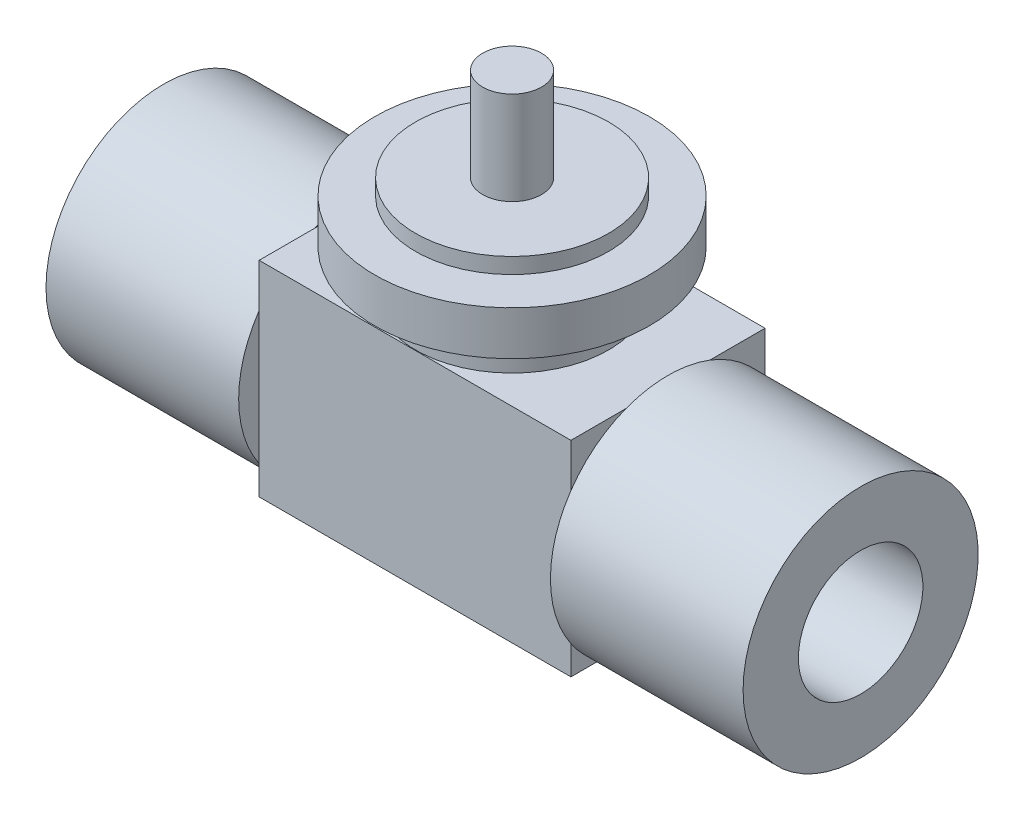
ISO-10303-21;
HEADER;
FILE_DESCRIPTION(('STEP AP214'),'2;1');
FILE_NAME('part.step','',(''),(''),'','','');
FILE_SCHEMA(('AUTOMOTIVE_DESIGN { 1 0 10303 214 1 1 1 1 }'));
ENDSEC;
DATA;
#1=APPLICATION_CONTEXT('core data for automotive mechanical design processes');
#2=APPLICATION_PROTOCOL_DEFINITION('international standard','automotive_design',2000,#1);
#3=PRODUCT_CONTEXT('',#1,'mechanical');
#4=PRODUCT('Part','Part','',(#3));
#5=PRODUCT_RELATED_PRODUCT_CATEGORY('part','',(#4));
#6=PRODUCT_DEFINITION_FORMATION('','',#4);
#7=PRODUCT_DEFINITION_CONTEXT('part definition',#1,'design');
#8=PRODUCT_DEFINITION('design','',#6,#7);
#9=PRODUCT_DEFINITION_SHAPE('','',#8);
#10=(LENGTH_UNIT() NAMED_UNIT(*) SI_UNIT(.MILLI.,.METRE.));
#11=(NAMED_UNIT(*) PLANE_ANGLE_UNIT() SI_UNIT($,.RADIAN.));
#12=(NAMED_UNIT(*) SI_UNIT($,.STERADIAN.) SOLID_ANGLE_UNIT());
#13=UNCERTAINTY_MEASURE_WITH_UNIT(LENGTH_MEASURE(1.E-05),#10,'distance_accuracy_value','');
#14=(GEOMETRIC_REPRESENTATION_CONTEXT(3) GLOBAL_UNCERTAINTY_ASSIGNED_CONTEXT((#13)) GLOBAL_UNIT_ASSIGNED_CONTEXT((#10,
#11,#12)) REPRESENTATION_CONTEXT('',''));
#15=CARTESIAN_POINT('',(0.,0.,0.));
#16=DIRECTION('',(0.,0.,1.));
#17=DIRECTION('',(1.,0.,0.));
#18=AXIS2_PLACEMENT_3D('',#15,#16,#17);
#19=CARTESIAN_POINT('',(-15.9,11.2,9.9));
#20=DIRECTION('',(1.,0.,0.));
#21=DIRECTION('',(0.,0.,-1.));
#22=AXIS2_PLACEMENT_3D('',#19,#20,#21);
#23=PLANE('',#22);
#24=CARTESIAN_POINT('',(-15.9,0.,0.));
#25=DIRECTION('',(-1.,0.,0.));
#26=DIRECTION('',(0.,0.,1.));
#27=AXIS2_PLACEMENT_3D('',#24,#25,#26);
#28=CIRCLE('',#27,11.988);
#29=CARTESIAN_POINT('',(-15.9,6.76033608631997,9.9));
#30=VERTEX_POINT('',#29);
#31=CARTESIAN_POINT('',(-15.9,11.2,4.27459284610828));
#32=VERTEX_POINT('',#31);
#33=EDGE_CURVE('E160',#30,#32,#28,.T.);
#34=ORIENTED_EDGE('',*,*,#33,.F.);
#35=DIRECTION('',(0.,-1.,0.));
#36=VECTOR('',#35,1.);
#37=CARTESIAN_POINT('',(-15.9,11.2,9.9));
#38=LINE('',#37,#36);
#39=CARTESIAN_POINT('',(-15.9,11.2,9.9));
#40=VERTEX_POINT('',#39);
#41=EDGE_CURVE('E136',#40,#30,#38,.T.);
#42=ORIENTED_EDGE('',*,*,#41,.F.);
#43=DIRECTION('',(0.,0.,-1.));
#44=VECTOR('',#43,1.);
#45=CARTESIAN_POINT('',(-15.9,11.2,9.9));
#46=LINE('',#45,#44);
#47=EDGE_CURVE('E205',#40,#32,#46,.T.);
#48=ORIENTED_EDGE('',*,*,#47,.T.);
#49=EDGE_LOOP('',(#34,#42,#48));
#50=FACE_BOUND('',#49,.T.);
#51=ADVANCED_FACE('F41',(#50),#23,.F.);
#52=CARTESIAN_POINT('',(-15.9,11.2,-4.27459284610828));
#53=VERTEX_POINT('',#52);
#54=CARTESIAN_POINT('',(-15.9,6.76033608631997,-9.9));
#55=VERTEX_POINT('',#54);
#56=EDGE_CURVE('E11',#53,#55,#28,.T.);
#57=ORIENTED_EDGE('',*,*,#56,.F.);
#58=CARTESIAN_POINT('',(-15.9,11.2,-9.9));
#59=VERTEX_POINT('',#58);
#60=EDGE_CURVE('E203',#53,#59,#46,.T.);
#61=ORIENTED_EDGE('',*,*,#60,.T.);
#62=DIRECTION('',(0.,-1.,0.));
#63=VECTOR('',#62,1.);
#64=CARTESIAN_POINT('',(-15.9,11.2,-9.9));
#65=LINE('',#64,#63);
#66=EDGE_CURVE('E182',#59,#55,#65,.T.);
#67=ORIENTED_EDGE('',*,*,#66,.T.);
#68=EDGE_LOOP('',(#57,#61,#67));
#69=FACE_BOUND('',#68,.T.);
#70=ADVANCED_FACE('F268',(#69),#23,.F.);
#71=CARTESIAN_POINT('',(-15.9,-6.76033608631997,-9.9));
#72=VERTEX_POINT('',#71);
#73=CARTESIAN_POINT('',(-15.9,-9.7,-7.04429868759127));
#74=VERTEX_POINT('',#73);
#75=EDGE_CURVE('E49',#72,#74,#28,.T.);
#76=ORIENTED_EDGE('',*,*,#75,.F.);
#77=CARTESIAN_POINT('',(-15.9,-9.7,-9.9));
#78=VERTEX_POINT('',#77);
#79=EDGE_CURVE('E183',#72,#78,#65,.T.);
#80=ORIENTED_EDGE('',*,*,#79,.T.);
#81=DIRECTION('',(0.,0.,-1.));
#82=VECTOR('',#81,1.);
#83=CARTESIAN_POINT('',(-15.9,-9.7,9.9));
#84=LINE('',#83,#82);
#85=EDGE_CURVE('E211',#74,#78,#84,.T.);
#86=ORIENTED_EDGE('',*,*,#85,.F.);
#87=EDGE_LOOP('',(#76,#80,#86));
#88=FACE_BOUND('',#87,.T.);
#89=ADVANCED_FACE('F277',(#88),#23,.F.);
#90=CARTESIAN_POINT('',(15.9,-9.7,9.9));
#91=DIRECTION('',(-1.,0.,0.));
#92=DIRECTION('',(0.,0.,1.));
#93=AXIS2_PLACEMENT_3D('',#90,#91,#92);
#94=PLANE('',#93);
#95=DIRECTION('',(0.,1.,0.));
#96=VECTOR('',#95,1.);
#97=CARTESIAN_POINT('',(15.9,-9.7,9.9));
#98=LINE('',#97,#96);
#99=CARTESIAN_POINT('',(15.9,6.76033608631997,9.9));
#100=VERTEX_POINT('',#99);
#101=CARTESIAN_POINT('',(15.9,11.2,9.9));
#102=VERTEX_POINT('',#101);
#103=EDGE_CURVE('E361',#100,#102,#98,.T.);
#104=ORIENTED_EDGE('',*,*,#103,.F.);
#105=CARTESIAN_POINT('',(15.9,0.,0.));
#106=DIRECTION('',(-1.,0.,0.));
#107=DIRECTION('',(0.,0.,1.));
#108=AXIS2_PLACEMENT_3D('',#105,#106,#107);
#109=CIRCLE('',#108,11.988);
#110=CARTESIAN_POINT('',(15.9,11.2,4.27459284610828));
#111=VERTEX_POINT('',#110);
#112=EDGE_CURVE('E171',#100,#111,#109,.T.);
#113=ORIENTED_EDGE('',*,*,#112,.T.);
#114=DIRECTION('',(0.,0.,-1.));
#115=VECTOR('',#114,1.);
#116=CARTESIAN_POINT('',(15.9,11.2,9.9));
#117=LINE('',#116,#115);
#118=EDGE_CURVE('E207',#102,#111,#117,.T.);
#119=ORIENTED_EDGE('',*,*,#118,.F.);
#120=EDGE_LOOP('',(#104,#113,#119));
#121=FACE_BOUND('',#120,.T.);
#122=ADVANCED_FACE('F288',(#121),#94,.F.);
#123=CARTESIAN_POINT('',(15.9,11.2,-4.27459284610828));
#124=VERTEX_POINT('',#123);
#125=CARTESIAN_POINT('',(15.9,11.2,-9.9));
#126=VERTEX_POINT('',#125);
#127=EDGE_CURVE('E201',#124,#126,#117,.T.);
#128=ORIENTED_EDGE('',*,*,#127,.F.);
#129=CARTESIAN_POINT('',(15.9,6.76033608631997,-9.9));
#130=VERTEX_POINT('',#129);
#131=EDGE_CURVE('E162',#124,#130,#109,.T.);
#132=ORIENTED_EDGE('',*,*,#131,.T.);
#133=DIRECTION('',(0.,1.,0.));
#134=VECTOR('',#133,1.);
#135=CARTESIAN_POINT('',(15.9,-9.7,-9.9));
#136=LINE('',#135,#134);
#137=EDGE_CURVE('E193',#130,#126,#136,.T.);
#138=ORIENTED_EDGE('',*,*,#137,.T.);
#139=EDGE_LOOP('',(#128,#132,#138));
#140=FACE_BOUND('',#139,.T.);
#141=ADVANCED_FACE('F290',(#140),#94,.F.);
#142=CARTESIAN_POINT('',(15.9,-9.7,-9.9));
#143=VERTEX_POINT('',#142);
#144=CARTESIAN_POINT('',(15.9,-6.76033608631997,-9.9));
#145=VERTEX_POINT('',#144);
#146=EDGE_CURVE('E196',#143,#145,#136,.T.);
#147=ORIENTED_EDGE('',*,*,#146,.T.);
#148=CARTESIAN_POINT('',(15.9,-9.7,-7.04429868759127));
#149=VERTEX_POINT('',#148);
#150=EDGE_CURVE('E165',#145,#149,#109,.T.);
#151=ORIENTED_EDGE('',*,*,#150,.T.);
#152=DIRECTION('',(0.,0.,-1.));
#153=VECTOR('',#152,1.);
#154=CARTESIAN_POINT('',(15.9,-9.7,9.9));
#155=LINE('',#154,#153);
#156=EDGE_CURVE('E209',#149,#143,#155,.T.);
#157=ORIENTED_EDGE('',*,*,#156,.T.);
#158=EDGE_LOOP('',(#147,#151,#157));
#159=FACE_BOUND('',#158,.T.);
#160=ADVANCED_FACE('F276',(#159),#94,.F.);
#161=CARTESIAN_POINT('',(-15.9,-9.7,7.04429868759127));
#162=VERTEX_POINT('',#161);
#163=CARTESIAN_POINT('',(-15.9,-6.76033608631997,9.9));
#164=VERTEX_POINT('',#163);
#165=EDGE_CURVE('E150',#162,#164,#28,.T.);
#166=ORIENTED_EDGE('',*,*,#165,.F.);
#167=CARTESIAN_POINT('',(-15.9,-9.7,9.9));
#168=VERTEX_POINT('',#167);
#169=EDGE_CURVE('E146',#168,#162,#84,.T.);
#170=ORIENTED_EDGE('',*,*,#169,.F.);
#171=EDGE_CURVE('E137',#164,#168,#38,.T.);
#172=ORIENTED_EDGE('',*,*,#171,.F.);
#173=EDGE_LOOP('',(#166,#170,#172));
#174=FACE_BOUND('',#173,.T.);
#175=ADVANCED_FACE('F43',(#174),#23,.F.);
#176=CARTESIAN_POINT('',(-15.9,-9.7,9.9));
#177=DIRECTION('',(0.,1.,0.));
#178=DIRECTION('',(0.,0.,1.));
#179=AXIS2_PLACEMENT_3D('',#176,#177,#178);
#180=PLANE('',#179);
#181=DIRECTION('',(1.,0.,0.));
#182=VECTOR('',#181,1.);
#183=CARTESIAN_POINT('',(-15.9,-9.7,-9.9));
#184=LINE('',#183,#182);
#185=EDGE_CURVE('E187',#78,#143,#184,.T.);
#186=ORIENTED_EDGE('',*,*,#185,.T.);
#187=ORIENTED_EDGE('',*,*,#156,.F.);
#188=CARTESIAN_POINT('',(15.9,-9.7,7.04429868759127));
#189=VERTEX_POINT('',#188);
#190=EDGE_CURVE('E213',#189,#149,#155,.T.);
#191=ORIENTED_EDGE('',*,*,#190,.F.);
#192=CARTESIAN_POINT('',(15.9,-9.7,9.9));
#193=VERTEX_POINT('',#192);
#194=EDGE_CURVE('E212',#193,#189,#155,.T.);
#195=ORIENTED_EDGE('',*,*,#194,.F.);
#196=DIRECTION('',(1.,0.,0.));
#197=VECTOR('',#196,1.);
#198=CARTESIAN_POINT('',(-15.9,-9.7,9.9));
#199=LINE('',#198,#197);
#200=EDGE_CURVE('E355',#168,#193,#199,.T.);
#201=ORIENTED_EDGE('',*,*,#200,.F.);
#202=ORIENTED_EDGE('',*,*,#169,.T.);
#203=EDGE_CURVE('E217',#162,#74,#84,.T.);
#204=ORIENTED_EDGE('',*,*,#203,.T.);
#205=ORIENTED_EDGE('',*,*,#85,.T.);
#206=EDGE_LOOP('',(#186,#187,#191,#195,#201,#202,#204,#205));
#207=FACE_BOUND('',#206,.T.);
#208=ADVANCED_FACE('F279',(#207),#180,.F.);
#209=ORIENTED_EDGE('',*,*,#194,.T.);
#210=CARTESIAN_POINT('',(15.9,-6.76033608631997,9.9));
#211=VERTEX_POINT('',#210);
#212=EDGE_CURVE('E216',#189,#211,#109,.T.);
#213=ORIENTED_EDGE('',*,*,#212,.T.);
#214=EDGE_CURVE('E352',#193,#211,#98,.T.);
#215=ORIENTED_EDGE('',*,*,#214,.F.);
#216=EDGE_LOOP('',(#209,#213,#215));
#217=FACE_BOUND('',#216,.T.);
#218=ADVANCED_FACE('F283',(#217),#94,.F.);
#219=CARTESIAN_POINT('',(15.9,11.2,9.9));
#220=DIRECTION('',(0.,-1.,0.));
#221=DIRECTION('',(0.,0.,-1.));
#222=AXIS2_PLACEMENT_3D('',#219,#220,#221);
#223=PLANE('',#222);
#224=CARTESIAN_POINT('',(0.,11.2,0.));
#225=DIRECTION('',(0.,-1.,0.));
#226=DIRECTION('',(0.,0.,-1.));
#227=AXIS2_PLACEMENT_3D('',#224,#225,#226);
#228=CIRCLE('',#227,9.85);
#229=CARTESIAN_POINT('',(0.,11.2,-9.85));
#230=VERTEX_POINT('',#229);
#231=EDGE_CURVE('E231',#230,#230,#228,.T.);
#232=ORIENTED_EDGE('',*,*,#231,.T.);
#233=EDGE_LOOP('',(#232));
#234=FACE_BOUND('',#233,.T.);
#235=DIRECTION('',(-1.,0.,0.));
#236=VECTOR('',#235,1.);
#237=CARTESIAN_POINT('',(15.9,11.2,-9.9));
#238=LINE('',#237,#236);
#239=EDGE_CURVE('E148',#126,#59,#238,.T.);
#240=ORIENTED_EDGE('',*,*,#239,.T.);
#241=ORIENTED_EDGE('',*,*,#60,.F.);
#242=EDGE_CURVE('E61',#32,#53,#46,.T.);
#243=ORIENTED_EDGE('',*,*,#242,.F.);
#244=ORIENTED_EDGE('',*,*,#47,.F.);
#245=DIRECTION('',(-1.,0.,0.));
#246=VECTOR('',#245,1.);
#247=CARTESIAN_POINT('',(15.9,11.2,9.9));
#248=LINE('',#247,#246);
#249=EDGE_CURVE('E192',#102,#40,#248,.T.);
#250=ORIENTED_EDGE('',*,*,#249,.F.);
#251=ORIENTED_EDGE('',*,*,#118,.T.);
#252=EDGE_CURVE('E208',#111,#124,#117,.T.);
#253=ORIENTED_EDGE('',*,*,#252,.T.);
#254=ORIENTED_EDGE('',*,*,#127,.T.);
#255=EDGE_LOOP('',(#240,#241,#243,#244,#250,#251,#253,#254));
#256=FACE_BOUND('',#255,.T.);
#257=ADVANCED_FACE('F340',(#234,#256),#223,.F.);
#258=CARTESIAN_POINT('',(0.,0.,9.9));
#259=DIRECTION('',(0.,0.,1.));
#260=DIRECTION('',(1.,0.,0.));
#261=AXIS2_PLACEMENT_3D('',#258,#259,#260);
#262=PLANE('',#261);
#263=ORIENTED_EDGE('',*,*,#41,.T.);
#264=EDGE_CURVE('E134',#30,#164,#38,.T.);
#265=ORIENTED_EDGE('',*,*,#264,.T.);
#266=ORIENTED_EDGE('',*,*,#171,.T.);
#267=ORIENTED_EDGE('',*,*,#200,.T.);
#268=ORIENTED_EDGE('',*,*,#214,.T.);
#269=EDGE_CURVE('E364',#211,#100,#98,.T.);
#270=ORIENTED_EDGE('',*,*,#269,.T.);
#271=ORIENTED_EDGE('',*,*,#103,.T.);
#272=ORIENTED_EDGE('',*,*,#249,.T.);
#273=EDGE_LOOP('',(#263,#265,#266,#267,#268,#270,#271,#272));
#274=FACE_BOUND('',#273,.T.);
#275=ADVANCED_FACE('F135',(#274),#262,.T.);
#276=CARTESIAN_POINT('',(0.,0.,-9.9));
#277=DIRECTION('',(0.,0.,1.));
#278=DIRECTION('',(1.,0.,0.));
#279=AXIS2_PLACEMENT_3D('',#276,#277,#278);
#280=PLANE('',#279);
#281=ORIENTED_EDGE('',*,*,#66,.F.);
#282=ORIENTED_EDGE('',*,*,#239,.F.);
#283=ORIENTED_EDGE('',*,*,#137,.F.);
#284=EDGE_CURVE('E198',#145,#130,#136,.T.);
#285=ORIENTED_EDGE('',*,*,#284,.F.);
#286=ORIENTED_EDGE('',*,*,#146,.F.);
#287=ORIENTED_EDGE('',*,*,#185,.F.);
#288=ORIENTED_EDGE('',*,*,#79,.F.);
#289=EDGE_CURVE('E177',#55,#72,#65,.T.);
#290=ORIENTED_EDGE('',*,*,#289,.F.);
#291=EDGE_LOOP('',(#281,#282,#283,#285,#286,#287,#288,#290));
#292=FACE_BOUND('',#291,.T.);
#293=ADVANCED_FACE('F296',(#292),#280,.F.);
#294=CARTESIAN_POINT('',(15.9,11.988,0.));
#295=DIRECTION('',(1.,0.,0.));
#296=DIRECTION('',(0.,0.,-1.));
#297=AXIS2_PLACEMENT_3D('',#294,#295,#296);
#298=PLANE('',#297);
#299=EDGE_CURVE('E377',#130,#145,#109,.T.);
#300=ORIENTED_EDGE('',*,*,#299,.T.);
#301=ORIENTED_EDGE('',*,*,#284,.T.);
#302=EDGE_LOOP('',(#300,#301));
#303=FACE_BOUND('',#302,.T.);
#304=ADVANCED_FACE('F331',(#303),#298,.F.);
#305=ORIENTED_EDGE('',*,*,#252,.F.);
#306=EDGE_CURVE('E168',#111,#124,#109,.T.);
#307=ORIENTED_EDGE('',*,*,#306,.T.);
#308=EDGE_LOOP('',(#305,#307));
#309=FACE_BOUND('',#308,.T.);
#310=ADVANCED_FACE('F384',(#309),#298,.F.);
#311=EDGE_CURVE('E167',#149,#189,#109,.T.);
#312=ORIENTED_EDGE('',*,*,#311,.T.);
#313=ORIENTED_EDGE('',*,*,#190,.T.);
#314=EDGE_LOOP('',(#312,#313));
#315=FACE_BOUND('',#314,.T.);
#316=ADVANCED_FACE('F335',(#315),#298,.F.);
#317=ORIENTED_EDGE('',*,*,#269,.F.);
#318=EDGE_CURVE('E166',#211,#100,#109,.T.);
#319=ORIENTED_EDGE('',*,*,#318,.T.);
#320=EDGE_LOOP('',(#317,#319));
#321=FACE_BOUND('',#320,.T.);
#322=ADVANCED_FACE('F329',(#321),#298,.F.);
#323=CARTESIAN_POINT('',(35.55,0.,0.));
#324=DIRECTION('',(-1.,0.,0.));
#325=DIRECTION('',(0.,0.,1.));
#326=AXIS2_PLACEMENT_3D('',#323,#324,#325);
#327=PLANE('',#326);
#328=CARTESIAN_POINT('',(35.55,0.,0.));
#329=DIRECTION('',(-1.,0.,0.));
#330=DIRECTION('',(0.,0.,1.));
#331=AXIS2_PLACEMENT_3D('',#328,#329,#330);
#332=CIRCLE('',#331,6.35);
#333=CARTESIAN_POINT('',(35.55,0.,6.35));
#334=VERTEX_POINT('',#333);
#335=EDGE_CURVE('E219',#334,#334,#332,.F.);
#336=ORIENTED_EDGE('',*,*,#335,.F.);
#337=EDGE_LOOP('',(#336));
#338=FACE_BOUND('',#337,.T.);
#339=CARTESIAN_POINT('',(35.55,0.,0.));
#340=DIRECTION('',(-1.,0.,0.));
#341=DIRECTION('',(0.,0.,1.));
#342=AXIS2_PLACEMENT_3D('',#339,#340,#341);
#343=CIRCLE('',#342,11.988);
#344=CARTESIAN_POINT('',(35.55,0.,11.988));
#345=VERTEX_POINT('',#344);
#346=EDGE_CURVE('E189',#345,#345,#343,.T.);
#347=ORIENTED_EDGE('',*,*,#346,.F.);
#348=EDGE_LOOP('',(#347));
#349=FACE_BOUND('',#348,.T.);
#350=ADVANCED_FACE('F321',(#338,#349),#327,.F.);
#351=CARTESIAN_POINT('',(-1000.,0.,0.));
#352=DIRECTION('',(-1.,0.,0.));
#353=DIRECTION('',(0.,0.,1.));
#354=AXIS2_PLACEMENT_3D('',#351,#352,#353);
#355=CYLINDRICAL_SURFACE('',#354,11.988);
#356=ORIENTED_EDGE('',*,*,#112,.F.);
#357=ORIENTED_EDGE('',*,*,#318,.F.);
#358=ORIENTED_EDGE('',*,*,#212,.F.);
#359=ORIENTED_EDGE('',*,*,#311,.F.);
#360=ORIENTED_EDGE('',*,*,#150,.F.);
#361=ORIENTED_EDGE('',*,*,#299,.F.);
#362=ORIENTED_EDGE('',*,*,#131,.F.);
#363=ORIENTED_EDGE('',*,*,#306,.F.);
#364=EDGE_LOOP('',(#356,#357,#358,#359,#360,#361,#362,#363));
#365=FACE_BOUND('',#364,.T.);
#366=ORIENTED_EDGE('',*,*,#346,.T.);
#367=EDGE_LOOP('',(#366));
#368=FACE_BOUND('',#367,.T.);
#369=ADVANCED_FACE('F314',(#365,#368),#355,.T.);
#370=CARTESIAN_POINT('',(-15.9,0.,0.));
#371=DIRECTION('',(-1.,0.,0.));
#372=DIRECTION('',(0.,0.,1.));
#373=AXIS2_PLACEMENT_3D('',#370,#371,#372);
#374=PLANE('',#373);
#375=EDGE_CURVE('E175',#55,#72,#28,.T.);
#376=ORIENTED_EDGE('',*,*,#375,.F.);
#377=ORIENTED_EDGE('',*,*,#289,.T.);
#378=EDGE_LOOP('',(#376,#377));
#379=FACE_BOUND('',#378,.T.);
#380=ADVANCED_FACE('F178',(#379),#374,.F.);
#381=ORIENTED_EDGE('',*,*,#203,.F.);
#382=EDGE_CURVE('E155',#74,#162,#28,.T.);
#383=ORIENTED_EDGE('',*,*,#382,.F.);
#384=EDGE_LOOP('',(#381,#383));
#385=FACE_BOUND('',#384,.T.);
#386=ADVANCED_FACE('F304',(#385),#374,.F.);
#387=EDGE_CURVE('E55',#32,#53,#28,.T.);
#388=ORIENTED_EDGE('',*,*,#387,.F.);
#389=ORIENTED_EDGE('',*,*,#242,.T.);
#390=EDGE_LOOP('',(#388,#389));
#391=FACE_BOUND('',#390,.T.);
#392=ADVANCED_FACE('F310',(#391),#374,.F.);
#393=CARTESIAN_POINT('',(-35.55,11.988,0.));
#394=DIRECTION('',(1.,0.,0.));
#395=DIRECTION('',(0.,0.,-1.));
#396=AXIS2_PLACEMENT_3D('',#393,#394,#395);
#397=PLANE('',#396);
#398=CARTESIAN_POINT('',(-35.55,0.,0.));
#399=DIRECTION('',(1.,0.,0.));
#400=DIRECTION('',(0.,0.,-1.));
#401=AXIS2_PLACEMENT_3D('',#398,#399,#400);
#402=CIRCLE('',#401,6.35);
#403=CARTESIAN_POINT('',(-35.55,0.,-6.35));
#404=VERTEX_POINT('',#403);
#405=EDGE_CURVE('E44',#404,#404,#402,.F.);
#406=ORIENTED_EDGE('',*,*,#405,.F.);
#407=EDGE_LOOP('',(#406));
#408=FACE_BOUND('',#407,.T.);
#409=CARTESIAN_POINT('',(-35.55,0.,0.));
#410=DIRECTION('',(-1.,0.,0.));
#411=DIRECTION('',(0.,0.,1.));
#412=AXIS2_PLACEMENT_3D('',#409,#410,#411);
#413=CIRCLE('',#412,11.988);
#414=CARTESIAN_POINT('',(-35.55,0.,11.988));
#415=VERTEX_POINT('',#414);
#416=EDGE_CURVE('E157',#415,#415,#413,.T.);
#417=ORIENTED_EDGE('',*,*,#416,.T.);
#418=EDGE_LOOP('',(#417));
#419=FACE_BOUND('',#418,.T.);
#420=ADVANCED_FACE('F312',(#408,#419),#397,.F.);
#421=ORIENTED_EDGE('',*,*,#264,.F.);
#422=EDGE_CURVE('E151',#164,#30,#28,.T.);
#423=ORIENTED_EDGE('',*,*,#422,.F.);
#424=EDGE_LOOP('',(#421,#423));
#425=FACE_BOUND('',#424,.T.);
#426=ADVANCED_FACE('F152',(#425),#374,.F.);
#427=CARTESIAN_POINT('',(-1000.,0.,0.));
#428=DIRECTION('',(-1.,0.,0.));
#429=DIRECTION('',(0.,0.,1.));
#430=AXIS2_PLACEMENT_3D('',#427,#428,#429);
#431=CYLINDRICAL_SURFACE('',#430,11.988);
#432=ORIENTED_EDGE('',*,*,#416,.F.);
#433=EDGE_LOOP('',(#432));
#434=FACE_BOUND('',#433,.T.);
#435=ORIENTED_EDGE('',*,*,#33,.T.);
#436=ORIENTED_EDGE('',*,*,#387,.T.);
#437=ORIENTED_EDGE('',*,*,#56,.T.);
#438=ORIENTED_EDGE('',*,*,#375,.T.);
#439=ORIENTED_EDGE('',*,*,#75,.T.);
#440=ORIENTED_EDGE('',*,*,#382,.T.);
#441=ORIENTED_EDGE('',*,*,#165,.T.);
#442=ORIENTED_EDGE('',*,*,#422,.T.);
#443=EDGE_LOOP('',(#435,#436,#437,#438,#439,#440,#441,#442));
#444=FACE_BOUND('',#443,.T.);
#445=ADVANCED_FACE('F156',(#434,#444),#431,.T.);
#446=CARTESIAN_POINT('',(-1000.,0.,0.));
#447=DIRECTION('',(-1.,0.,0.));
#448=DIRECTION('',(0.,0.,1.));
#449=AXIS2_PLACEMENT_3D('',#446,#447,#448);
#450=CYLINDRICAL_SURFACE('',#449,6.35);
#451=CARTESIAN_POINT('',(12.6500000000001,0.,0.));
#452=DIRECTION('',(-1.,0.,0.));
#453=DIRECTION('',(0.,0.,1.));
#454=AXIS2_PLACEMENT_3D('',#451,#452,#453);
#455=CIRCLE('',#454,6.35);
#456=CARTESIAN_POINT('',(12.6500000000001,0.,6.35));
#457=VERTEX_POINT('',#456);
#458=EDGE_CURVE('E220',#457,#457,#455,.T.);
#459=ORIENTED_EDGE('',*,*,#458,.T.);
#460=EDGE_LOOP('',(#459));
#461=FACE_BOUND('',#460,.T.);
#462=ORIENTED_EDGE('',*,*,#335,.T.);
#463=EDGE_LOOP('',(#462));
#464=FACE_BOUND('',#463,.T.);
#465=ADVANCED_FACE('F479',(#461,#464),#450,.F.);
#466=CARTESIAN_POINT('',(12.65,6.35,0.));
#467=DIRECTION('',(1.,0.,0.));
#468=DIRECTION('',(0.,0.,-1.));
#469=AXIS2_PLACEMENT_3D('',#466,#467,#468);
#470=PLANE('',#469);
#471=ORIENTED_EDGE('',*,*,#458,.F.);
#472=EDGE_LOOP('',(#471));
#473=FACE_BOUND('',#472,.T.);
#474=ADVANCED_FACE('F488',(#473),#470,.T.);
#475=CARTESIAN_POINT('',(-1000.,0.,0.));
#476=DIRECTION('',(-1.,0.,0.));
#477=DIRECTION('',(0.,0.,1.));
#478=AXIS2_PLACEMENT_3D('',#475,#476,#477);
#479=CYLINDRICAL_SURFACE('',#478,6.35);
#480=CARTESIAN_POINT('',(-12.6500000000001,0.,0.));
#481=DIRECTION('',(-1.,0.,0.));
#482=DIRECTION('',(0.,0.,1.));
#483=AXIS2_PLACEMENT_3D('',#480,#481,#482);
#484=CIRCLE('',#483,6.35);
#485=CARTESIAN_POINT('',(-12.6500000000001,0.,6.35));
#486=VERTEX_POINT('',#485);
#487=EDGE_CURVE('E230',#486,#486,#484,.T.);
#488=ORIENTED_EDGE('',*,*,#487,.F.);
#489=EDGE_LOOP('',(#488));
#490=FACE_BOUND('',#489,.T.);
#491=ORIENTED_EDGE('',*,*,#405,.T.);
#492=EDGE_LOOP('',(#491));
#493=FACE_BOUND('',#492,.T.);
#494=ADVANCED_FACE('F494',(#490,#493),#479,.F.);
#495=CARTESIAN_POINT('',(-12.65,0.,0.));
#496=DIRECTION('',(-1.,0.,0.));
#497=DIRECTION('',(0.,0.,1.));
#498=AXIS2_PLACEMENT_3D('',#495,#496,#497);
#499=PLANE('',#498);
#500=ORIENTED_EDGE('',*,*,#487,.T.);
#501=EDGE_LOOP('',(#500));
#502=FACE_BOUND('',#501,.T.);
#503=ADVANCED_FACE('F505',(#502),#499,.T.);
#504=CARTESIAN_POINT('',(0.,-500.,0.));
#505=DIRECTION('',(0.,-1.,0.));
#506=DIRECTION('',(0.,0.,-1.));
#507=AXIS2_PLACEMENT_3D('',#504,#505,#506);
#508=CYLINDRICAL_SURFACE('',#507,9.85);
#509=CARTESIAN_POINT('',(0.,15.4,0.));
#510=DIRECTION('',(0.,-1.,0.));
#511=DIRECTION('',(0.,0.,-1.));
#512=AXIS2_PLACEMENT_3D('',#509,#510,#511);
#513=CIRCLE('',#512,9.85);
#514=CARTESIAN_POINT('',(0.,15.4,-9.85));
#515=VERTEX_POINT('',#514);
#516=EDGE_CURVE('E236',#515,#515,#513,.T.);
#517=ORIENTED_EDGE('',*,*,#516,.T.);
#518=EDGE_LOOP('',(#517));
#519=FACE_BOUND('',#518,.T.);
#520=ORIENTED_EDGE('',*,*,#231,.F.);
#521=EDGE_LOOP('',(#520));
#522=FACE_BOUND('',#521,.T.);
#523=ADVANCED_FACE('F515',(#519,#522),#508,.T.);
#524=CARTESIAN_POINT('',(9.85,15.4,0.));
#525=DIRECTION('',(0.,-1.,0.));
#526=DIRECTION('',(0.,0.,-1.));
#527=AXIS2_PLACEMENT_3D('',#524,#525,#526);
#528=PLANE('',#527);
#529=CARTESIAN_POINT('',(0.,15.4,0.));
#530=DIRECTION('',(0.,-1.,0.));
#531=DIRECTION('',(0.,0.,-1.));
#532=AXIS2_PLACEMENT_3D('',#529,#530,#531);
#533=CIRCLE('',#532,14.);
#534=CARTESIAN_POINT('',(0.,15.4,-14.));
#535=VERTEX_POINT('',#534);
#536=EDGE_CURVE('E237',#535,#535,#533,.T.);
#537=ORIENTED_EDGE('',*,*,#536,.T.);
#538=EDGE_LOOP('',(#537));
#539=FACE_BOUND('',#538,.T.);
#540=ORIENTED_EDGE('',*,*,#516,.F.);
#541=EDGE_LOOP('',(#540));
#542=FACE_BOUND('',#541,.T.);
#543=ADVANCED_FACE('F522',(#539,#542),#528,.T.);
#544=CARTESIAN_POINT('',(0.,-500.,0.));
#545=DIRECTION('',(0.,-1.,0.));
#546=DIRECTION('',(0.,0.,-1.));
#547=AXIS2_PLACEMENT_3D('',#544,#545,#546);
#548=CYLINDRICAL_SURFACE('',#547,14.);
#549=CARTESIAN_POINT('',(0.,19.9,0.));
#550=DIRECTION('',(0.,-1.,0.));
#551=DIRECTION('',(0.,0.,-1.));
#552=AXIS2_PLACEMENT_3D('',#549,#550,#551);
#553=CIRCLE('',#552,14.);
#554=CARTESIAN_POINT('',(0.,19.9,-14.));
#555=VERTEX_POINT('',#554);
#556=EDGE_CURVE('E245',#555,#555,#553,.T.);
#557=ORIENTED_EDGE('',*,*,#556,.T.);
#558=EDGE_LOOP('',(#557));
#559=FACE_BOUND('',#558,.T.);
#560=ORIENTED_EDGE('',*,*,#536,.F.);
#561=EDGE_LOOP('',(#560));
#562=FACE_BOUND('',#561,.T.);
#563=ADVANCED_FACE('F535',(#559,#562),#548,.T.);
#564=CARTESIAN_POINT('',(14.,19.9,0.));
#565=DIRECTION('',(0.,1.,0.));
#566=DIRECTION('',(0.,0.,1.));
#567=AXIS2_PLACEMENT_3D('',#564,#565,#566);
#568=PLANE('',#567);
#569=CARTESIAN_POINT('',(0.,19.9,0.));
#570=DIRECTION('',(0.,-1.,0.));
#571=DIRECTION('',(0.,0.,-1.));
#572=AXIS2_PLACEMENT_3D('',#569,#570,#571);
#573=CIRCLE('',#572,9.85);
#574=CARTESIAN_POINT('',(0.,19.9,-9.85));
#575=VERTEX_POINT('',#574);
#576=EDGE_CURVE('E244',#575,#575,#573,.T.);
#577=ORIENTED_EDGE('',*,*,#576,.T.);
#578=EDGE_LOOP('',(#577));
#579=FACE_BOUND('',#578,.T.);
#580=ORIENTED_EDGE('',*,*,#556,.F.);
#581=EDGE_LOOP('',(#580));
#582=FACE_BOUND('',#581,.T.);
#583=ADVANCED_FACE('F542',(#579,#582),#568,.T.);
#584=CARTESIAN_POINT('',(0.,-500.,0.));
#585=DIRECTION('',(0.,-1.,0.));
#586=DIRECTION('',(0.,0.,-1.));
#587=AXIS2_PLACEMENT_3D('',#584,#585,#586);
#588=CYLINDRICAL_SURFACE('',#587,9.85);
#589=CARTESIAN_POINT('',(0.,21.5,0.));
#590=DIRECTION('',(0.,-1.,0.));
#591=DIRECTION('',(0.,0.,-1.));
#592=AXIS2_PLACEMENT_3D('',#589,#590,#591);
#593=CIRCLE('',#592,9.85);
#594=CARTESIAN_POINT('',(0.,21.5,-9.85));
#595=VERTEX_POINT('',#594);
#596=EDGE_CURVE('E247',#595,#595,#593,.T.);
#597=ORIENTED_EDGE('',*,*,#596,.T.);
#598=EDGE_LOOP('',(#597));
#599=FACE_BOUND('',#598,.T.);
#600=ORIENTED_EDGE('',*,*,#576,.F.);
#601=EDGE_LOOP('',(#600));
#602=FACE_BOUND('',#601,.T.);
#603=ADVANCED_FACE('F552',(#599,#602),#588,.T.);
#604=CARTESIAN_POINT('',(9.85,21.5,0.));
#605=DIRECTION('',(0.,1.,0.));
#606=DIRECTION('',(0.,0.,1.));
#607=AXIS2_PLACEMENT_3D('',#604,#605,#606);
#608=PLANE('',#607);
#609=CARTESIAN_POINT('',(0.,21.5,0.));
#610=DIRECTION('',(0.,-1.,0.));
#611=DIRECTION('',(0.,0.,-1.));
#612=AXIS2_PLACEMENT_3D('',#609,#610,#611);
#613=CIRCLE('',#612,3.);
#614=CARTESIAN_POINT('',(0.,21.5,-3.));
#615=VERTEX_POINT('',#614);
#616=EDGE_CURVE('E252',#615,#615,#613,.T.);
#617=ORIENTED_EDGE('',*,*,#616,.T.);
#618=EDGE_LOOP('',(#617));
#619=FACE_BOUND('',#618,.T.);
#620=ORIENTED_EDGE('',*,*,#596,.F.);
#621=EDGE_LOOP('',(#620));
#622=FACE_BOUND('',#621,.T.);
#623=ADVANCED_FACE('F270',(#619,#622),#608,.T.);
#624=CARTESIAN_POINT('',(0.,-500.,0.));
#625=DIRECTION('',(0.,-1.,0.));
#626=DIRECTION('',(0.,0.,-1.));
#627=AXIS2_PLACEMENT_3D('',#624,#625,#626);
#628=CYLINDRICAL_SURFACE('',#627,3.);
#629=CARTESIAN_POINT('',(0.,31.,0.));
#630=DIRECTION('',(0.,-1.,0.));
#631=DIRECTION('',(0.,0.,-1.));
#632=AXIS2_PLACEMENT_3D('',#629,#630,#631);
#633=CIRCLE('',#632,3.);
#634=CARTESIAN_POINT('',(0.,31.,-3.));
#635=VERTEX_POINT('',#634);
#636=EDGE_CURVE('E251',#635,#635,#633,.T.);
#637=ORIENTED_EDGE('',*,*,#636,.T.);
#638=EDGE_LOOP('',(#637));
#639=FACE_BOUND('',#638,.T.);
#640=ORIENTED_EDGE('',*,*,#616,.F.);
#641=EDGE_LOOP('',(#640));
#642=FACE_BOUND('',#641,.T.);
#643=ADVANCED_FACE('F259',(#639,#642),#628,.T.);
#644=CARTESIAN_POINT('',(3.,31.,0.));
#645=DIRECTION('',(0.,1.,0.));
#646=DIRECTION('',(0.,0.,1.));
#647=AXIS2_PLACEMENT_3D('',#644,#645,#646);
#648=PLANE('',#647);
#649=ORIENTED_EDGE('',*,*,#636,.F.);
#650=EDGE_LOOP('',(#649));
#651=FACE_BOUND('',#650,.T.);
#652=ADVANCED_FACE('F261',(#651),#648,.T.);
#653=CLOSED_SHELL('',(#51,#70,#89,#122,#141,#160,#175,#208,#218,#257,#275,#293,#304,#310,#316,
#322,#350,#369,#380,#386,#392,#420,#426,#445,#465,#474,#494,#503,#523,#543,#563,#583,#603,#623,
#643,#652));
#654=MANIFOLD_SOLID_BREP('B2',#653);
#655=ADVANCED_BREP_SHAPE_REPRESENTATION('',(#18,#654),#14);
#656=SHAPE_DEFINITION_REPRESENTATION(#9,#655);
ENDSEC;
END-ISO-10303-21;
